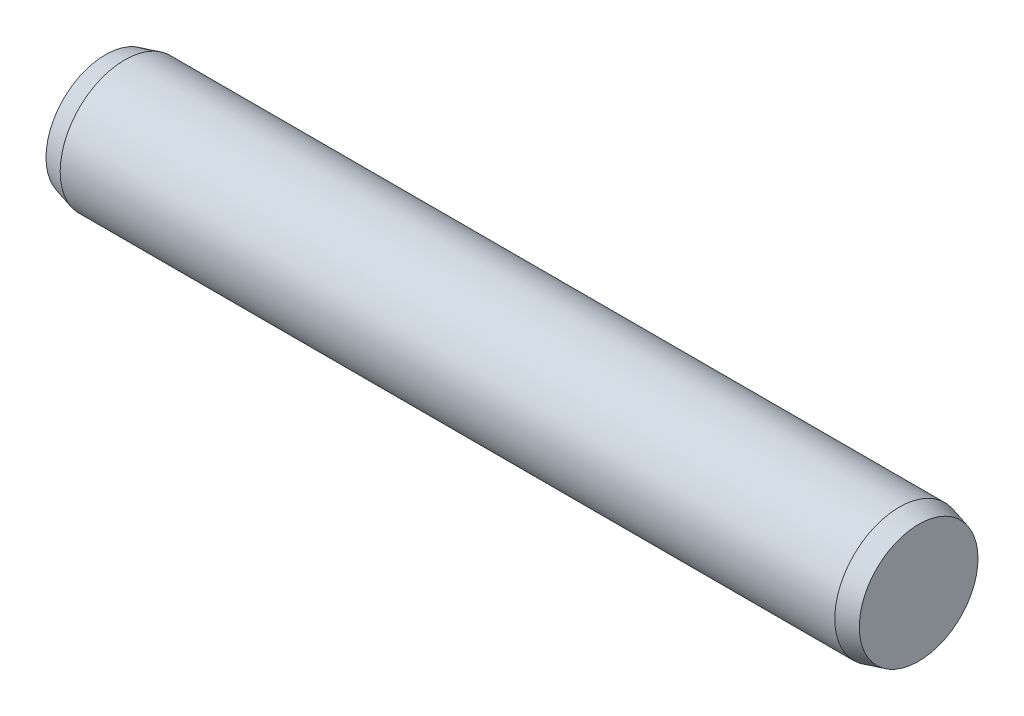
ISO-10303-21;
HEADER;
FILE_DESCRIPTION(('STEP AP214'),'2;1');
FILE_NAME('part.step','',(''),(''),'','','');
FILE_SCHEMA(('AUTOMOTIVE_DESIGN { 1 0 10303 214 1 1 1 1 }'));
ENDSEC;
DATA;
#1=APPLICATION_CONTEXT('core data for automotive mechanical design processes');
#2=APPLICATION_PROTOCOL_DEFINITION('international standard','automotive_design',2000,#1);
#3=PRODUCT_CONTEXT('',#1,'mechanical');
#4=PRODUCT('Part','Part','',(#3));
#5=PRODUCT_RELATED_PRODUCT_CATEGORY('part','',(#4));
#6=PRODUCT_DEFINITION_FORMATION('','',#4);
#7=PRODUCT_DEFINITION_CONTEXT('part definition',#1,'design');
#8=PRODUCT_DEFINITION('design','',#6,#7);
#9=PRODUCT_DEFINITION_SHAPE('','',#8);
#10=(LENGTH_UNIT() NAMED_UNIT(*) SI_UNIT(.MILLI.,.METRE.));
#11=(NAMED_UNIT(*) PLANE_ANGLE_UNIT() SI_UNIT($,.RADIAN.));
#12=(NAMED_UNIT(*) SI_UNIT($,.STERADIAN.) SOLID_ANGLE_UNIT());
#13=UNCERTAINTY_MEASURE_WITH_UNIT(LENGTH_MEASURE(1.E-05),#10,'distance_accuracy_value','');
#14=(GEOMETRIC_REPRESENTATION_CONTEXT(3) GLOBAL_UNCERTAINTY_ASSIGNED_CONTEXT((#13)) GLOBAL_UNIT_ASSIGNED_CONTEXT((#10,
#11,#12)) REPRESENTATION_CONTEXT('',''));
#15=CARTESIAN_POINT('',(0.,0.,0.));
#16=DIRECTION('',(0.,0.,1.));
#17=DIRECTION('',(1.,0.,0.));
#18=AXIS2_PLACEMENT_3D('',#15,#16,#17);
#19=CARTESIAN_POINT('',(-9.,0.,0.));
#20=DIRECTION('',(1.,0.,0.));
#21=DIRECTION('',(0.,0.,-1.));
#22=AXIS2_PLACEMENT_3D('',#19,#20,#21);
#23=CYLINDRICAL_SURFACE('',#22,1.5);
#24=CARTESIAN_POINT('',(-9.,0.,0.));
#25=DIRECTION('',(-1.,0.,0.));
#26=DIRECTION('',(0.,0.,1.));
#27=AXIS2_PLACEMENT_3D('',#24,#25,#26);
#28=CIRCLE('',#27,1.5);
#29=CARTESIAN_POINT('',(-9.,0.,1.5));
#30=VERTEX_POINT('',#29);
#31=EDGE_CURVE('E43',#30,#30,#28,.T.);
#32=ORIENTED_EDGE('',*,*,#31,.F.);
#33=EDGE_LOOP('',(#32));
#34=FACE_BOUND('',#33,.T.);
#35=CARTESIAN_POINT('',(9.,0.,0.));
#36=DIRECTION('',(1.,0.,0.));
#37=DIRECTION('',(0.,0.,-1.));
#38=AXIS2_PLACEMENT_3D('',#35,#36,#37);
#39=CIRCLE('',#38,1.5);
#40=CARTESIAN_POINT('',(9.,0.,-1.5));
#41=VERTEX_POINT('',#40);
#42=EDGE_CURVE('E10',#41,#41,#39,.T.);
#43=ORIENTED_EDGE('',*,*,#42,.F.);
#44=EDGE_LOOP('',(#43));
#45=FACE_BOUND('',#44,.T.);
#46=ADVANCED_FACE('F29',(#34,#45),#23,.T.);
#47=CARTESIAN_POINT('',(9.,0.,0.));
#48=DIRECTION('',(-1.,0.,0.));
#49=DIRECTION('',(0.,0.,-1.));
#50=AXIS2_PLACEMENT_3D('',#47,#48,#49);
#51=CONICAL_SURFACE('',#50,1.5,0.26179938779915);
#52=CARTESIAN_POINT('',(9.45,0.,0.));
#53=DIRECTION('',(1.,0.,0.));
#54=DIRECTION('',(0.,0.,-1.));
#55=AXIS2_PLACEMENT_3D('',#52,#53,#54);
#56=CIRCLE('',#55,1.379422863406);
#57=CARTESIAN_POINT('',(9.45,0.,-1.379422863406));
#58=VERTEX_POINT('',#57);
#59=EDGE_CURVE('E35',#58,#58,#56,.T.);
#60=ORIENTED_EDGE('',*,*,#59,.F.);
#61=EDGE_LOOP('',(#60));
#62=FACE_BOUND('',#61,.T.);
#63=ORIENTED_EDGE('',*,*,#42,.T.);
#64=EDGE_LOOP('',(#63));
#65=FACE_BOUND('',#64,.T.);
#66=ADVANCED_FACE('F53',(#62,#65),#51,.T.);
#67=CARTESIAN_POINT('',(9.45,0.,0.));
#68=DIRECTION('',(1.,0.,0.));
#69=DIRECTION('',(0.,0.,-1.));
#70=AXIS2_PLACEMENT_3D('',#67,#68,#69);
#71=PLANE('',#70);
#72=ORIENTED_EDGE('',*,*,#59,.T.);
#73=EDGE_LOOP('',(#72));
#74=FACE_BOUND('',#73,.T.);
#75=ADVANCED_FACE('F57',(#74),#71,.T.);
#76=CARTESIAN_POINT('',(-9.,0.,0.));
#77=DIRECTION('',(1.,0.,0.));
#78=DIRECTION('',(0.,0.,1.));
#79=AXIS2_PLACEMENT_3D('',#76,#77,#78);
#80=CONICAL_SURFACE('',#79,1.5,0.26179938779915);
#81=CARTESIAN_POINT('',(-9.45,0.,0.));
#82=DIRECTION('',(-1.,0.,0.));
#83=DIRECTION('',(0.,0.,1.));
#84=AXIS2_PLACEMENT_3D('',#81,#82,#83);
#85=CIRCLE('',#84,1.379422863406);
#86=CARTESIAN_POINT('',(-9.45,0.,1.379422863406));
#87=VERTEX_POINT('',#86);
#88=EDGE_CURVE('E39',#87,#87,#85,.T.);
#89=ORIENTED_EDGE('',*,*,#88,.F.);
#90=EDGE_LOOP('',(#89));
#91=FACE_BOUND('',#90,.T.);
#92=ORIENTED_EDGE('',*,*,#31,.T.);
#93=EDGE_LOOP('',(#92));
#94=FACE_BOUND('',#93,.T.);
#95=ADVANCED_FACE('F49',(#91,#94),#80,.T.);
#96=CARTESIAN_POINT('',(-9.45,0.,0.));
#97=DIRECTION('',(-1.,0.,0.));
#98=DIRECTION('',(0.,0.,1.));
#99=AXIS2_PLACEMENT_3D('',#96,#97,#98);
#100=PLANE('',#99);
#101=ORIENTED_EDGE('',*,*,#88,.T.);
#102=EDGE_LOOP('',(#101));
#103=FACE_BOUND('',#102,.T.);
#104=ADVANCED_FACE('F66',(#103),#100,.T.);
#105=CLOSED_SHELL('',(#46,#66,#75,#95,#104));
#106=MANIFOLD_SOLID_BREP('B2',#105);
#107=ADVANCED_BREP_SHAPE_REPRESENTATION('',(#18,#106),#14);
#108=SHAPE_DEFINITION_REPRESENTATION(#9,#107);
ENDSEC;
END-ISO-10303-21;
